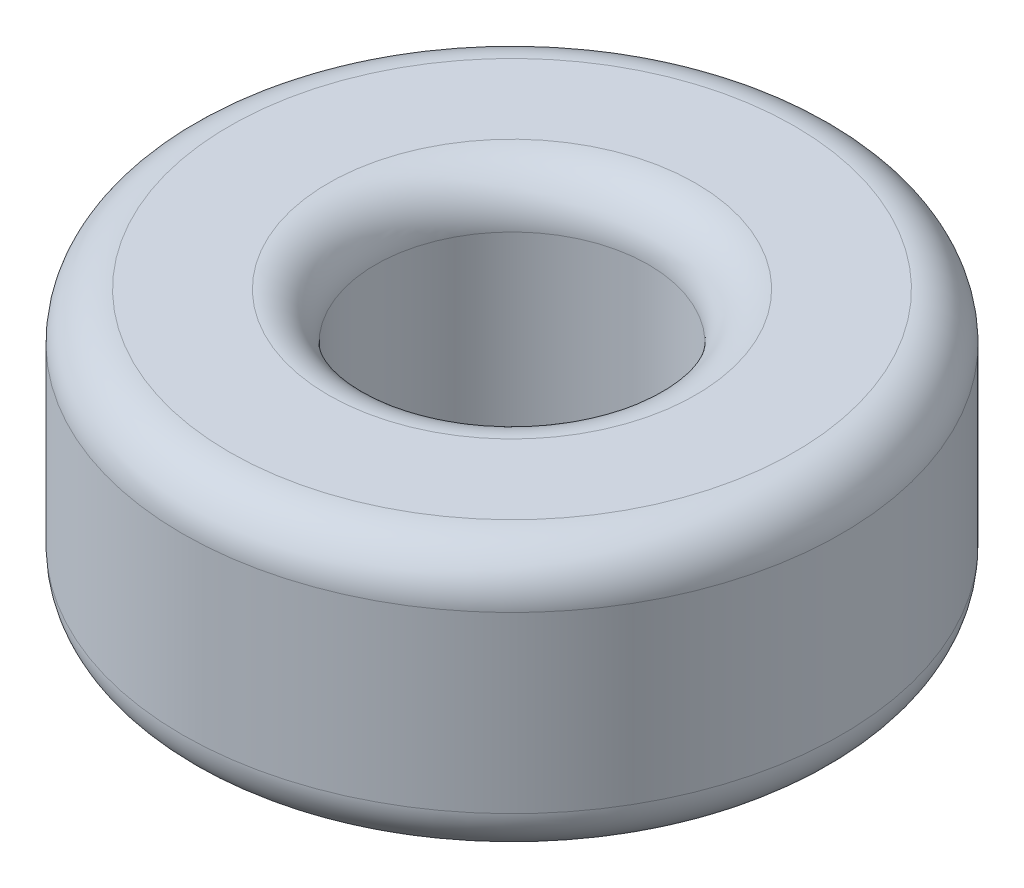
ISO-10303-21;
HEADER;
FILE_DESCRIPTION(('STEP AP214'),'2;1');
FILE_NAME('part.step','',(''),(''),'','','');
FILE_SCHEMA(('AUTOMOTIVE_DESIGN { 1 0 10303 214 1 1 1 1 }'));
ENDSEC;
DATA;
#1=APPLICATION_CONTEXT('core data for automotive mechanical design processes');
#2=APPLICATION_PROTOCOL_DEFINITION('international standard','automotive_design',2000,#1);
#3=PRODUCT_CONTEXT('',#1,'mechanical');
#4=PRODUCT('Part','Part','',(#3));
#5=PRODUCT_RELATED_PRODUCT_CATEGORY('part','',(#4));
#6=PRODUCT_DEFINITION_FORMATION('','',#4);
#7=PRODUCT_DEFINITION_CONTEXT('part definition',#1,'design');
#8=PRODUCT_DEFINITION('design','',#6,#7);
#9=PRODUCT_DEFINITION_SHAPE('','',#8);
#10=(LENGTH_UNIT() NAMED_UNIT(*) SI_UNIT(.MILLI.,.METRE.));
#11=(NAMED_UNIT(*) PLANE_ANGLE_UNIT() SI_UNIT($,.RADIAN.));
#12=(NAMED_UNIT(*) SI_UNIT($,.STERADIAN.) SOLID_ANGLE_UNIT());
#13=UNCERTAINTY_MEASURE_WITH_UNIT(LENGTH_MEASURE(1.E-05),#10,'distance_accuracy_value','');
#14=(GEOMETRIC_REPRESENTATION_CONTEXT(3) GLOBAL_UNCERTAINTY_ASSIGNED_CONTEXT((#13)) GLOBAL_UNIT_ASSIGNED_CONTEXT((#10,
#11,#12)) REPRESENTATION_CONTEXT('',''));
#15=CARTESIAN_POINT('',(0.,0.,0.));
#16=DIRECTION('',(0.,0.,1.));
#17=DIRECTION('',(1.,0.,0.));
#18=AXIS2_PLACEMENT_3D('',#15,#16,#17);
#19=CARTESIAN_POINT('',(0.,57.,0.));
#20=DIRECTION('',(0.,1.,0.));
#21=DIRECTION('',(0.,0.,1.));
#22=AXIS2_PLACEMENT_3D('',#19,#20,#21);
#23=PLANE('',#22);
#24=CARTESIAN_POINT('',(0.,57.,0.));
#25=DIRECTION('',(0.,1.,0.));
#26=DIRECTION('',(0.,0.,1.));
#27=AXIS2_PLACEMENT_3D('',#24,#25,#26);
#28=CIRCLE('',#27,39.);
#29=CARTESIAN_POINT('',(0.,57.,39.));
#30=VERTEX_POINT('',#29);
#31=EDGE_CURVE('E57',#30,#30,#28,.F.);
#32=ORIENTED_EDGE('',*,*,#31,.T.);
#33=EDGE_LOOP('',(#32));
#34=FACE_BOUND('',#33,.T.);
#35=CARTESIAN_POINT('',(0.,57.,0.));
#36=DIRECTION('',(0.,1.,0.));
#37=DIRECTION('',(0.,0.,1.));
#38=AXIS2_PLACEMENT_3D('',#35,#36,#37);
#39=CIRCLE('',#38,60.);
#40=CARTESIAN_POINT('',(0.,57.,60.));
#41=VERTEX_POINT('',#40);
#42=EDGE_CURVE('E75',#41,#41,#39,.T.);
#43=ORIENTED_EDGE('',*,*,#42,.T.);
#44=EDGE_LOOP('',(#43));
#45=FACE_BOUND('',#44,.T.);
#46=ADVANCED_FACE('F46',(#34,#45),#23,.T.);
#47=CARTESIAN_POINT('',(0.,0.,0.));
#48=DIRECTION('',(0.,1.,0.));
#49=DIRECTION('',(0.,0.,1.));
#50=AXIS2_PLACEMENT_3D('',#47,#48,#49);
#51=PLANE('',#50);
#52=CARTESIAN_POINT('',(0.,0.,0.));
#53=DIRECTION('',(0.,1.,0.));
#54=DIRECTION('',(0.,0.,1.));
#55=AXIS2_PLACEMENT_3D('',#52,#53,#54);
#56=CIRCLE('',#55,39.);
#57=CARTESIAN_POINT('',(0.,0.,39.));
#58=VERTEX_POINT('',#57);
#59=EDGE_CURVE('E53',#58,#58,#56,.T.);
#60=ORIENTED_EDGE('',*,*,#59,.T.);
#61=EDGE_LOOP('',(#60));
#62=FACE_BOUND('',#61,.T.);
#63=CARTESIAN_POINT('',(0.,0.,0.));
#64=DIRECTION('',(0.,1.,0.));
#65=DIRECTION('',(0.,0.,1.));
#66=AXIS2_PLACEMENT_3D('',#63,#64,#65);
#67=CIRCLE('',#66,60.);
#68=CARTESIAN_POINT('',(0.,0.,60.));
#69=VERTEX_POINT('',#68);
#70=EDGE_CURVE('E66',#69,#69,#67,.F.);
#71=ORIENTED_EDGE('',*,*,#70,.T.);
#72=EDGE_LOOP('',(#71));
#73=FACE_BOUND('',#72,.T.);
#74=ADVANCED_FACE('F98',(#62,#73),#51,.F.);
#75=CARTESIAN_POINT('',(0.,57.,0.));
#76=DIRECTION('',(0.,-1.,0.));
#77=DIRECTION('',(0.,0.,-1.));
#78=AXIS2_PLACEMENT_3D('',#75,#76,#77);
#79=CYLINDRICAL_SURFACE('',#78,70.);
#80=CARTESIAN_POINT('',(0.,10.,0.));
#81=DIRECTION('',(0.,1.,0.));
#82=DIRECTION('',(0.,0.,1.));
#83=AXIS2_PLACEMENT_3D('',#80,#81,#82);
#84=CIRCLE('',#83,70.);
#85=CARTESIAN_POINT('',(0.,9.99999999999999,-70.));
#86=VERTEX_POINT('',#85);
#87=EDGE_CURVE('E69',#86,#86,#84,.T.);
#88=CARTESIAN_POINT('',(0.,47.,0.));
#89=DIRECTION('',(0.,1.,0.));
#90=DIRECTION('',(0.,0.,1.));
#91=AXIS2_PLACEMENT_3D('',#88,#89,#90);
#92=CIRCLE('',#91,70.);
#93=CARTESIAN_POINT('',(0.,47.,-70.));
#94=VERTEX_POINT('',#93);
#95=EDGE_CURVE('E72',#94,#94,#92,.F.);
#96=CARTESIAN_POINT('',(0.,9.99999999999999,-70.));
#97=CARTESIAN_POINT('',(0.,10.3854166666667,-70.));
#98=CARTESIAN_POINT('',(0.,10.7708333333333,-70.));
#99=CARTESIAN_POINT('',(0.,11.5416666666667,-70.));
#100=CARTESIAN_POINT('',(0.,11.9270833333333,-70.));
#101=CARTESIAN_POINT('',(0.,12.6979166666667,-70.));
#102=CARTESIAN_POINT('',(0.,13.0833333333333,-70.));
#103=CARTESIAN_POINT('',(0.,13.8541666666667,-70.));
#104=CARTESIAN_POINT('',(0.,14.2395833333333,-70.));
#105=CARTESIAN_POINT('',(0.,15.0104166666667,-70.));
#106=CARTESIAN_POINT('',(0.,15.3958333333333,-70.));
#107=CARTESIAN_POINT('',(0.,16.1666666666667,-70.));
#108=CARTESIAN_POINT('',(0.,16.5520833333333,-70.));
#109=CARTESIAN_POINT('',(0.,17.3229166666667,-70.));
#110=CARTESIAN_POINT('',(0.,17.7083333333333,-70.));
#111=CARTESIAN_POINT('',(0.,18.4791666666667,-70.));
#112=CARTESIAN_POINT('',(0.,18.8645833333333,-70.));
#113=CARTESIAN_POINT('',(0.,19.6354166666667,-70.));
#114=CARTESIAN_POINT('',(0.,20.0208333333333,-70.));
#115=CARTESIAN_POINT('',(0.,20.7916666666667,-70.));
#116=CARTESIAN_POINT('',(0.,21.1770833333333,-70.));
#117=CARTESIAN_POINT('',(0.,21.9479166666667,-70.));
#118=CARTESIAN_POINT('',(0.,22.3333333333333,-70.));
#119=CARTESIAN_POINT('',(0.,23.1041666666667,-70.));
#120=CARTESIAN_POINT('',(0.,23.4895833333333,-70.));
#121=CARTESIAN_POINT('',(0.,24.2604166666667,-70.));
#122=CARTESIAN_POINT('',(0.,24.6458333333333,-70.));
#123=CARTESIAN_POINT('',(0.,25.4166666666667,-70.));
#124=CARTESIAN_POINT('',(0.,25.8020833333333,-70.));
#125=CARTESIAN_POINT('',(0.,26.5729166666667,-70.));
#126=CARTESIAN_POINT('',(0.,26.9583333333333,-70.));
#127=CARTESIAN_POINT('',(0.,27.7291666666667,-70.));
#128=CARTESIAN_POINT('',(0.,28.1145833333333,-70.));
#129=CARTESIAN_POINT('',(0.,28.8854166666667,-70.));
#130=CARTESIAN_POINT('',(0.,29.2708333333333,-70.));
#131=CARTESIAN_POINT('',(0.,30.0416666666667,-70.));
#132=CARTESIAN_POINT('',(0.,30.4270833333333,-70.));
#133=CARTESIAN_POINT('',(0.,31.1979166666667,-70.));
#134=CARTESIAN_POINT('',(0.,31.5833333333333,-70.));
#135=CARTESIAN_POINT('',(0.,32.3541666666667,-70.));
#136=CARTESIAN_POINT('',(0.,32.7395833333333,-70.));
#137=CARTESIAN_POINT('',(0.,33.5104166666667,-70.));
#138=CARTESIAN_POINT('',(0.,33.8958333333333,-70.));
#139=CARTESIAN_POINT('',(0.,34.6666666666667,-70.));
#140=CARTESIAN_POINT('',(0.,35.0520833333333,-70.));
#141=CARTESIAN_POINT('',(0.,35.8229166666667,-70.));
#142=CARTESIAN_POINT('',(0.,36.2083333333333,-70.));
#143=CARTESIAN_POINT('',(0.,36.9791666666667,-70.));
#144=CARTESIAN_POINT('',(0.,37.3645833333333,-70.));
#145=CARTESIAN_POINT('',(0.,38.1354166666667,-70.));
#146=CARTESIAN_POINT('',(0.,38.5208333333333,-70.));
#147=CARTESIAN_POINT('',(0.,39.2916666666667,-70.));
#148=CARTESIAN_POINT('',(0.,39.6770833333333,-70.));
#149=CARTESIAN_POINT('',(0.,40.4479166666667,-70.));
#150=CARTESIAN_POINT('',(0.,40.8333333333333,-70.));
#151=CARTESIAN_POINT('',(0.,41.6041666666667,-70.));
#152=CARTESIAN_POINT('',(0.,41.9895833333333,-70.));
#153=CARTESIAN_POINT('',(0.,42.7604166666667,-70.));
#154=CARTESIAN_POINT('',(0.,43.1458333333333,-70.));
#155=CARTESIAN_POINT('',(0.,43.9166666666667,-70.));
#156=CARTESIAN_POINT('',(0.,44.3020833333333,-70.));
#157=CARTESIAN_POINT('',(0.,45.0729166666667,-70.));
#158=CARTESIAN_POINT('',(0.,45.4583333333333,-70.));
#159=CARTESIAN_POINT('',(0.,46.2291666666667,-70.));
#160=CARTESIAN_POINT('',(0.,46.6145833333333,-70.));
#161=CARTESIAN_POINT('',(0.,47.,-70.));
#162=B_SPLINE_CURVE_WITH_KNOTS('',3,(#96,#97,#98,#99,#100,#101,#102,#103,#104,#105,#106,#107,
#108,#109,#110,#111,#112,#113,#114,#115,#116,#117,#118,#119,#120,#121,#122,#123,#124,#125,#126,
#127,#128,#129,#130,#131,#132,#133,#134,#135,#136,#137,#138,#139,#140,#141,#142,#143,#144,#145,
#146,#147,#148,#149,#150,#151,#152,#153,#154,#155,#156,#157,#158,#159,#160,#161),.UNSPECIFIED.,
.F.,.F.,(4,2,2,2,2,2,2,2,2,2,2,2,2,2,2,2,2,2,2,2,2,2,2,2,2,2,2,2,2,2,2,2,4),(0.,1.15625,2.3125,
3.46875,4.625,5.78125,6.9375,8.09375,9.25,10.40625,11.5625,12.71875,13.875,15.03125,16.1875,
17.34375,18.5,19.65625,20.8125,21.96875,23.125,24.28125,25.4375,26.59375,27.75,28.90625,30.0625,
31.21875,32.375,33.53125,34.6875,35.84375,37.),.UNSPECIFIED.);
#163=EDGE_CURVE('BSEAM93',#86,#94,#162,.T.);
#164=ORIENTED_EDGE('',*,*,#87,.T.);
#165=ORIENTED_EDGE('',*,*,#95,.T.);
#166=ORIENTED_EDGE('',*,*,#163,.T.);
#167=ORIENTED_EDGE('',*,*,#163,.F.);
#168=EDGE_LOOP('',(#164,#166,#165,#167));
#169=FACE_BOUND('',#168,.T.);
#170=ADVANCED_FACE('F93',(#169),#79,.T.);
#171=CARTESIAN_POINT('',(0.,57.,0.));
#172=DIRECTION('',(0.,-1.,0.));
#173=DIRECTION('',(0.,0.,-1.));
#174=AXIS2_PLACEMENT_3D('',#171,#172,#173);
#175=CYLINDRICAL_SURFACE('',#174,29.);
#176=CARTESIAN_POINT('',(0.,10.,0.));
#177=DIRECTION('',(0.,1.,0.));
#178=DIRECTION('',(0.,0.,1.));
#179=AXIS2_PLACEMENT_3D('',#176,#177,#178);
#180=CIRCLE('',#179,29.);
#181=CARTESIAN_POINT('',(0.,9.99999999999999,-29.));
#182=VERTEX_POINT('',#181);
#183=EDGE_CURVE('E12',#182,#182,#180,.F.);
#184=CARTESIAN_POINT('',(0.,47.,0.));
#185=DIRECTION('',(0.,1.,0.));
#186=DIRECTION('',(0.,0.,1.));
#187=AXIS2_PLACEMENT_3D('',#184,#185,#186);
#188=CIRCLE('',#187,29.);
#189=CARTESIAN_POINT('',(0.,47.,-29.));
#190=VERTEX_POINT('',#189);
#191=EDGE_CURVE('E61',#190,#190,#188,.T.);
#192=CARTESIAN_POINT('',(0.,9.99999999999999,-29.));
#193=CARTESIAN_POINT('',(0.,10.3854166666667,-29.));
#194=CARTESIAN_POINT('',(0.,10.7708333333333,-29.));
#195=CARTESIAN_POINT('',(0.,11.5416666666667,-29.));
#196=CARTESIAN_POINT('',(0.,11.9270833333333,-29.));
#197=CARTESIAN_POINT('',(0.,12.6979166666667,-29.));
#198=CARTESIAN_POINT('',(0.,13.0833333333333,-29.));
#199=CARTESIAN_POINT('',(0.,13.8541666666667,-29.));
#200=CARTESIAN_POINT('',(0.,14.2395833333333,-29.));
#201=CARTESIAN_POINT('',(0.,15.0104166666667,-29.));
#202=CARTESIAN_POINT('',(0.,15.3958333333333,-29.));
#203=CARTESIAN_POINT('',(0.,16.1666666666667,-29.));
#204=CARTESIAN_POINT('',(0.,16.5520833333333,-29.));
#205=CARTESIAN_POINT('',(0.,17.3229166666667,-29.));
#206=CARTESIAN_POINT('',(0.,17.7083333333333,-29.));
#207=CARTESIAN_POINT('',(0.,18.4791666666667,-29.));
#208=CARTESIAN_POINT('',(0.,18.8645833333333,-29.));
#209=CARTESIAN_POINT('',(0.,19.6354166666667,-29.));
#210=CARTESIAN_POINT('',(0.,20.0208333333333,-29.));
#211=CARTESIAN_POINT('',(0.,20.7916666666667,-29.));
#212=CARTESIAN_POINT('',(0.,21.1770833333333,-29.));
#213=CARTESIAN_POINT('',(0.,21.9479166666667,-29.));
#214=CARTESIAN_POINT('',(0.,22.3333333333333,-29.));
#215=CARTESIAN_POINT('',(0.,23.1041666666667,-29.));
#216=CARTESIAN_POINT('',(0.,23.4895833333333,-29.));
#217=CARTESIAN_POINT('',(0.,24.2604166666667,-29.));
#218=CARTESIAN_POINT('',(0.,24.6458333333333,-29.));
#219=CARTESIAN_POINT('',(0.,25.4166666666667,-29.));
#220=CARTESIAN_POINT('',(0.,25.8020833333333,-29.));
#221=CARTESIAN_POINT('',(0.,26.5729166666667,-29.));
#222=CARTESIAN_POINT('',(0.,26.9583333333333,-29.));
#223=CARTESIAN_POINT('',(0.,27.7291666666667,-29.));
#224=CARTESIAN_POINT('',(0.,28.1145833333333,-29.));
#225=CARTESIAN_POINT('',(0.,28.8854166666667,-29.));
#226=CARTESIAN_POINT('',(0.,29.2708333333333,-29.));
#227=CARTESIAN_POINT('',(0.,30.0416666666667,-29.));
#228=CARTESIAN_POINT('',(0.,30.4270833333333,-29.));
#229=CARTESIAN_POINT('',(0.,31.1979166666667,-29.));
#230=CARTESIAN_POINT('',(0.,31.5833333333333,-29.));
#231=CARTESIAN_POINT('',(0.,32.3541666666667,-29.));
#232=CARTESIAN_POINT('',(0.,32.7395833333333,-29.));
#233=CARTESIAN_POINT('',(0.,33.5104166666667,-29.));
#234=CARTESIAN_POINT('',(0.,33.8958333333333,-29.));
#235=CARTESIAN_POINT('',(0.,34.6666666666667,-29.));
#236=CARTESIAN_POINT('',(0.,35.0520833333333,-29.));
#237=CARTESIAN_POINT('',(0.,35.8229166666667,-29.));
#238=CARTESIAN_POINT('',(0.,36.2083333333333,-29.));
#239=CARTESIAN_POINT('',(0.,36.9791666666667,-29.));
#240=CARTESIAN_POINT('',(0.,37.3645833333333,-29.));
#241=CARTESIAN_POINT('',(0.,38.1354166666667,-29.));
#242=CARTESIAN_POINT('',(0.,38.5208333333333,-29.));
#243=CARTESIAN_POINT('',(0.,39.2916666666667,-29.));
#244=CARTESIAN_POINT('',(0.,39.6770833333333,-29.));
#245=CARTESIAN_POINT('',(0.,40.4479166666667,-29.));
#246=CARTESIAN_POINT('',(0.,40.8333333333333,-29.));
#247=CARTESIAN_POINT('',(0.,41.6041666666667,-29.));
#248=CARTESIAN_POINT('',(0.,41.9895833333333,-29.));
#249=CARTESIAN_POINT('',(0.,42.7604166666667,-29.));
#250=CARTESIAN_POINT('',(0.,43.1458333333333,-29.));
#251=CARTESIAN_POINT('',(0.,43.9166666666667,-29.));
#252=CARTESIAN_POINT('',(0.,44.3020833333333,-29.));
#253=CARTESIAN_POINT('',(0.,45.0729166666667,-29.));
#254=CARTESIAN_POINT('',(0.,45.4583333333333,-29.));
#255=CARTESIAN_POINT('',(0.,46.2291666666667,-29.));
#256=CARTESIAN_POINT('',(0.,46.6145833333333,-29.));
#257=CARTESIAN_POINT('',(0.,47.,-29.));
#258=B_SPLINE_CURVE_WITH_KNOTS('',3,(#192,#193,#194,#195,#196,#197,#198,#199,#200,#201,#202,
#203,#204,#205,#206,#207,#208,#209,#210,#211,#212,#213,#214,#215,#216,#217,#218,#219,#220,#221,
#222,#223,#224,#225,#226,#227,#228,#229,#230,#231,#232,#233,#234,#235,#236,#237,#238,#239,#240,
#241,#242,#243,#244,#245,#246,#247,#248,#249,#250,#251,#252,#253,#254,#255,#256,#257),
.UNSPECIFIED.,.F.,.F.,(4,2,2,2,2,2,2,2,2,2,2,2,2,2,2,2,2,2,2,2,2,2,2,2,2,2,2,2,2,2,2,2,4),(0.,
1.15625,2.3125,3.46875,4.625,5.78125,6.9375,8.09375,9.25,10.40625,11.5625,12.71875,13.875,
15.03125,16.1875,17.34375,18.5,19.65625,20.8125,21.96875,23.125,24.28125,25.4375,26.59375,27.75,
28.90625,30.0625,31.21875,32.375,33.53125,34.6875,35.84375,37.),.UNSPECIFIED.);
#259=EDGE_CURVE('BSEAM83',#182,#190,#258,.T.);
#260=ORIENTED_EDGE('',*,*,#183,.T.);
#261=ORIENTED_EDGE('',*,*,#191,.T.);
#262=ORIENTED_EDGE('',*,*,#259,.T.);
#263=ORIENTED_EDGE('',*,*,#259,.F.);
#264=EDGE_LOOP('',(#260,#262,#261,#263));
#265=FACE_BOUND('',#264,.T.);
#266=ADVANCED_FACE('F83',(#265),#175,.F.);
#267=CARTESIAN_POINT('',(0.,47.,0.));
#268=DIRECTION('',(0.,1.,0.));
#269=DIRECTION('',(0.,0.,1.));
#270=AXIS2_PLACEMENT_3D('',#267,#268,#269);
#271=TOROIDAL_SURFACE('',#270,60.,10.);
#272=ORIENTED_EDGE('',*,*,#95,.F.);
#273=EDGE_LOOP('',(#272));
#274=FACE_BOUND('',#273,.T.);
#275=ORIENTED_EDGE('',*,*,#42,.F.);
#276=EDGE_LOOP('',(#275));
#277=FACE_BOUND('',#276,.T.);
#278=ADVANCED_FACE('F80',(#274,#277),#271,.T.);
#279=CARTESIAN_POINT('',(0.,10.,0.));
#280=DIRECTION('',(0.,1.,0.));
#281=DIRECTION('',(0.,0.,1.));
#282=AXIS2_PLACEMENT_3D('',#279,#280,#281);
#283=TOROIDAL_SURFACE('',#282,60.,10.);
#284=ORIENTED_EDGE('',*,*,#70,.F.);
#285=EDGE_LOOP('',(#284));
#286=FACE_BOUND('',#285,.T.);
#287=ORIENTED_EDGE('',*,*,#87,.F.);
#288=EDGE_LOOP('',(#287));
#289=FACE_BOUND('',#288,.T.);
#290=ADVANCED_FACE('F82',(#286,#289),#283,.T.);
#291=CARTESIAN_POINT('',(0.,47.,0.));
#292=DIRECTION('',(0.,1.,0.));
#293=DIRECTION('',(0.,0.,1.));
#294=AXIS2_PLACEMENT_3D('',#291,#292,#293);
#295=TOROIDAL_SURFACE('',#294,39.,10.);
#296=ORIENTED_EDGE('',*,*,#31,.F.);
#297=EDGE_LOOP('',(#296));
#298=FACE_BOUND('',#297,.T.);
#299=ORIENTED_EDGE('',*,*,#191,.F.);
#300=EDGE_LOOP('',(#299));
#301=FACE_BOUND('',#300,.T.);
#302=ADVANCED_FACE('F90',(#298,#301),#295,.T.);
#303=CARTESIAN_POINT('',(0.,10.,0.));
#304=DIRECTION('',(0.,1.,0.));
#305=DIRECTION('',(0.,0.,1.));
#306=AXIS2_PLACEMENT_3D('',#303,#304,#305);
#307=TOROIDAL_SURFACE('',#306,39.,10.);
#308=ORIENTED_EDGE('',*,*,#183,.F.);
#309=EDGE_LOOP('',(#308));
#310=FACE_BOUND('',#309,.T.);
#311=ORIENTED_EDGE('',*,*,#59,.F.);
#312=EDGE_LOOP('',(#311));
#313=FACE_BOUND('',#312,.T.);
#314=ADVANCED_FACE('F48',(#310,#313),#307,.T.);
#315=CLOSED_SHELL('',(#46,#74,#170,#266,#278,#290,#302,#314));
#316=MANIFOLD_SOLID_BREP('B2',#315);
#317=ADVANCED_BREP_SHAPE_REPRESENTATION('',(#18,#316),#14);
#318=SHAPE_DEFINITION_REPRESENTATION(#9,#317);
ENDSEC;
END-ISO-10303-21;
